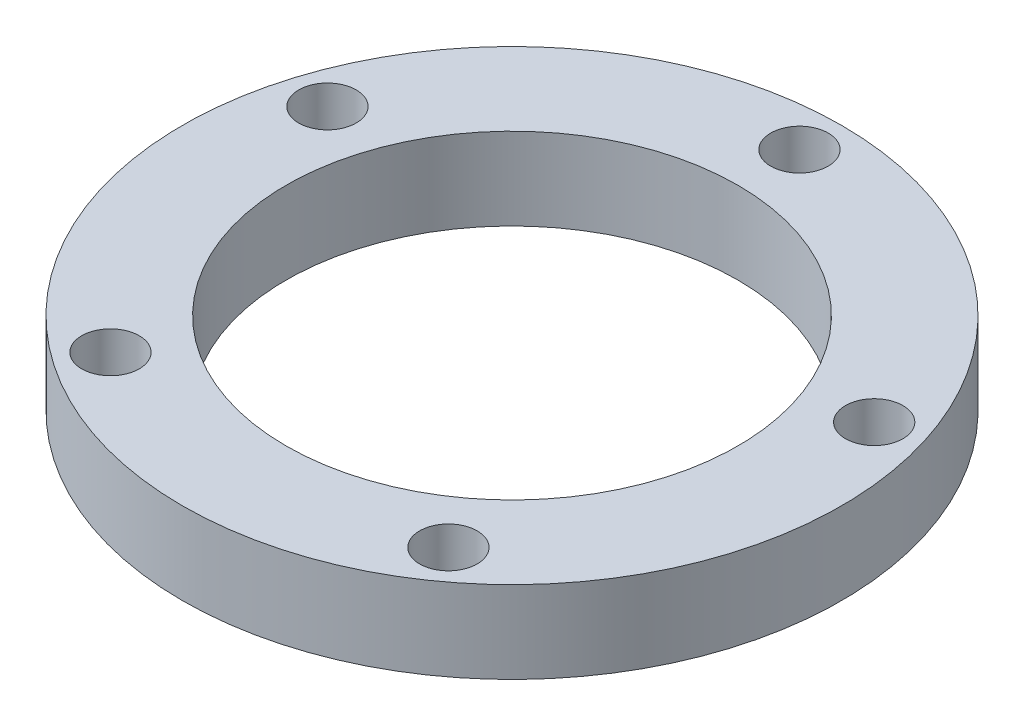
ISO-10303-21;
HEADER;
FILE_DESCRIPTION(('STEP AP214'),'2;1');
FILE_NAME('part.step','',(''),(''),'','','');
FILE_SCHEMA(('AUTOMOTIVE_DESIGN { 1 0 10303 214 1 1 1 1 }'));
ENDSEC;
DATA;
#1=APPLICATION_CONTEXT('core data for automotive mechanical design processes');
#2=APPLICATION_PROTOCOL_DEFINITION('international standard','automotive_design',2000,#1);
#3=PRODUCT_CONTEXT('',#1,'mechanical');
#4=PRODUCT('Part','Part','',(#3));
#5=PRODUCT_RELATED_PRODUCT_CATEGORY('part','',(#4));
#6=PRODUCT_DEFINITION_FORMATION('','',#4);
#7=PRODUCT_DEFINITION_CONTEXT('part definition',#1,'design');
#8=PRODUCT_DEFINITION('design','',#6,#7);
#9=PRODUCT_DEFINITION_SHAPE('','',#8);
#10=(LENGTH_UNIT() NAMED_UNIT(*) SI_UNIT(.MILLI.,.METRE.));
#11=(NAMED_UNIT(*) PLANE_ANGLE_UNIT() SI_UNIT($,.RADIAN.));
#12=(NAMED_UNIT(*) SI_UNIT($,.STERADIAN.) SOLID_ANGLE_UNIT());
#13=UNCERTAINTY_MEASURE_WITH_UNIT(LENGTH_MEASURE(1.E-05),#10,'distance_accuracy_value','');
#14=(GEOMETRIC_REPRESENTATION_CONTEXT(3) GLOBAL_UNCERTAINTY_ASSIGNED_CONTEXT((#13)) GLOBAL_UNIT_ASSIGNED_CONTEXT((#10,
#11,#12)) REPRESENTATION_CONTEXT('',''));
#15=CARTESIAN_POINT('',(0.,0.,0.));
#16=DIRECTION('',(0.,0.,1.));
#17=DIRECTION('',(1.,0.,0.));
#18=AXIS2_PLACEMENT_3D('',#15,#16,#17);
#19=CARTESIAN_POINT('',(0.,10.,0.));
#20=DIRECTION('',(0.,-1.,0.));
#21=DIRECTION('',(0.,0.,-1.));
#22=AXIS2_PLACEMENT_3D('',#19,#20,#21);
#23=CYLINDRICAL_SURFACE('',#22,40.125);
#24=CARTESIAN_POINT('',(0.,10.,0.));
#25=DIRECTION('',(0.,1.,0.));
#26=DIRECTION('',(0.,0.,1.));
#27=AXIS2_PLACEMENT_3D('',#24,#25,#26);
#28=CIRCLE('',#27,40.125);
#29=CARTESIAN_POINT('',(0.,10.,40.125));
#30=VERTEX_POINT('',#29);
#31=EDGE_CURVE('E10',#30,#30,#28,.T.);
#32=ORIENTED_EDGE('',*,*,#31,.F.);
#33=EDGE_LOOP('',(#32));
#34=FACE_BOUND('',#33,.T.);
#35=CARTESIAN_POINT('',(0.,0.,0.));
#36=DIRECTION('',(0.,1.,0.));
#37=DIRECTION('',(0.,0.,1.));
#38=AXIS2_PLACEMENT_3D('',#35,#36,#37);
#39=CIRCLE('',#38,40.125);
#40=CARTESIAN_POINT('',(0.,0.,40.125));
#41=VERTEX_POINT('',#40);
#42=EDGE_CURVE('E34',#41,#41,#39,.T.);
#43=ORIENTED_EDGE('',*,*,#42,.T.);
#44=EDGE_LOOP('',(#43));
#45=FACE_BOUND('',#44,.T.);
#46=ADVANCED_FACE('F31',(#34,#45),#23,.T.);
#47=CARTESIAN_POINT('',(0.,10.,0.));
#48=DIRECTION('',(0.,1.,0.));
#49=DIRECTION('',(0.,0.,1.));
#50=AXIS2_PLACEMENT_3D('',#47,#48,#49);
#51=PLANE('',#50);
#52=CARTESIAN_POINT('',(0.,10.,-35.));
#53=DIRECTION('',(0.,1.,0.));
#54=DIRECTION('',(0.,0.,1.));
#55=AXIS2_PLACEMENT_3D('',#52,#53,#54);
#56=CIRCLE('',#55,3.5);
#57=CARTESIAN_POINT('',(0.,10.,-31.5));
#58=VERTEX_POINT('',#57);
#59=EDGE_CURVE('E73',#58,#58,#56,.T.);
#60=ORIENTED_EDGE('',*,*,#59,.F.);
#61=EDGE_LOOP('',(#60));
#62=FACE_BOUND('',#61,.T.);
#63=CARTESIAN_POINT('',(33.2869780703304,10.,-10.8155948031232));
#64=DIRECTION('',(0.,1.,0.));
#65=DIRECTION('',(0.,0.,1.));
#66=AXIS2_PLACEMENT_3D('',#63,#64,#65);
#67=CIRCLE('',#66,3.5);
#68=CARTESIAN_POINT('',(33.2869780703304,10.,-7.31559480312317));
#69=VERTEX_POINT('',#68);
#70=EDGE_CURVE('E67',#69,#69,#67,.T.);
#71=ORIENTED_EDGE('',*,*,#70,.F.);
#72=EDGE_LOOP('',(#71));
#73=FACE_BOUND('',#72,.T.);
#74=CARTESIAN_POINT('',(20.5724838302366,10.,28.3155948031232));
#75=DIRECTION('',(0.,1.,0.));
#76=DIRECTION('',(0.,0.,1.));
#77=AXIS2_PLACEMENT_3D('',#74,#75,#76);
#78=CIRCLE('',#77,3.5);
#79=CARTESIAN_POINT('',(20.5724838302366,10.,31.8155948031232));
#80=VERTEX_POINT('',#79);
#81=EDGE_CURVE('E61',#80,#80,#78,.T.);
#82=ORIENTED_EDGE('',*,*,#81,.F.);
#83=EDGE_LOOP('',(#82));
#84=FACE_BOUND('',#83,.T.);
#85=CARTESIAN_POINT('',(-20.5724838302366,10.,28.3155948031232));
#86=DIRECTION('',(0.,1.,0.));
#87=DIRECTION('',(0.,0.,1.));
#88=AXIS2_PLACEMENT_3D('',#85,#86,#87);
#89=CIRCLE('',#88,3.5);
#90=CARTESIAN_POINT('',(-20.5724838302366,10.,31.8155948031232));
#91=VERTEX_POINT('',#90);
#92=EDGE_CURVE('E55',#91,#91,#89,.T.);
#93=ORIENTED_EDGE('',*,*,#92,.F.);
#94=EDGE_LOOP('',(#93));
#95=FACE_BOUND('',#94,.T.);
#96=CARTESIAN_POINT('',(-33.2869780703304,10.,-10.8155948031232));
#97=DIRECTION('',(0.,1.,0.));
#98=DIRECTION('',(0.,0.,1.));
#99=AXIS2_PLACEMENT_3D('',#96,#97,#98);
#100=CIRCLE('',#99,3.5);
#101=CARTESIAN_POINT('',(-33.2869780703304,10.,-7.31559480312315));
#102=VERTEX_POINT('',#101);
#103=EDGE_CURVE('E49',#102,#102,#100,.T.);
#104=ORIENTED_EDGE('',*,*,#103,.F.);
#105=EDGE_LOOP('',(#104));
#106=FACE_BOUND('',#105,.T.);
#107=CARTESIAN_POINT('',(0.,10.,0.));
#108=DIRECTION('',(0.,1.,0.));
#109=DIRECTION('',(0.,0.,1.));
#110=AXIS2_PLACEMENT_3D('',#107,#108,#109);
#111=CIRCLE('',#110,27.5);
#112=CARTESIAN_POINT('',(0.,10.,27.5));
#113=VERTEX_POINT('',#112);
#114=EDGE_CURVE('E43',#113,#113,#111,.T.);
#115=ORIENTED_EDGE('',*,*,#114,.F.);
#116=EDGE_LOOP('',(#115));
#117=FACE_BOUND('',#116,.T.);
#118=ORIENTED_EDGE('',*,*,#31,.T.);
#119=EDGE_LOOP('',(#118));
#120=FACE_BOUND('',#119,.T.);
#121=ADVANCED_FACE('F89',(#62,#73,#84,#95,#106,#117,#120),#51,.T.);
#122=CARTESIAN_POINT('',(0.,0.,0.));
#123=DIRECTION('',(0.,1.,0.));
#124=DIRECTION('',(0.,0.,1.));
#125=AXIS2_PLACEMENT_3D('',#122,#123,#124);
#126=PLANE('',#125);
#127=CARTESIAN_POINT('',(0.,0.,-35.));
#128=DIRECTION('',(0.,1.,0.));
#129=DIRECTION('',(0.,0.,1.));
#130=AXIS2_PLACEMENT_3D('',#127,#128,#129);
#131=CIRCLE('',#130,3.5);
#132=CARTESIAN_POINT('',(0.,0.,-31.5));
#133=VERTEX_POINT('',#132);
#134=EDGE_CURVE('E46',#133,#133,#131,.T.);
#135=ORIENTED_EDGE('',*,*,#134,.T.);
#136=EDGE_LOOP('',(#135));
#137=FACE_BOUND('',#136,.T.);
#138=CARTESIAN_POINT('',(33.2869780703304,0.,-10.8155948031232));
#139=DIRECTION('',(0.,1.,0.));
#140=DIRECTION('',(0.,0.,1.));
#141=AXIS2_PLACEMENT_3D('',#138,#139,#140);
#142=CIRCLE('',#141,3.5);
#143=CARTESIAN_POINT('',(33.2869780703304,0.,-7.31559480312317));
#144=VERTEX_POINT('',#143);
#145=EDGE_CURVE('E70',#144,#144,#142,.T.);
#146=ORIENTED_EDGE('',*,*,#145,.T.);
#147=EDGE_LOOP('',(#146));
#148=FACE_BOUND('',#147,.T.);
#149=CARTESIAN_POINT('',(20.5724838302366,0.,28.3155948031232));
#150=DIRECTION('',(0.,1.,0.));
#151=DIRECTION('',(0.,0.,1.));
#152=AXIS2_PLACEMENT_3D('',#149,#150,#151);
#153=CIRCLE('',#152,3.5);
#154=CARTESIAN_POINT('',(20.5724838302366,0.,31.8155948031232));
#155=VERTEX_POINT('',#154);
#156=EDGE_CURVE('E64',#155,#155,#153,.T.);
#157=ORIENTED_EDGE('',*,*,#156,.T.);
#158=EDGE_LOOP('',(#157));
#159=FACE_BOUND('',#158,.T.);
#160=CARTESIAN_POINT('',(-20.5724838302366,0.,28.3155948031232));
#161=DIRECTION('',(0.,1.,0.));
#162=DIRECTION('',(0.,0.,1.));
#163=AXIS2_PLACEMENT_3D('',#160,#161,#162);
#164=CIRCLE('',#163,3.5);
#165=CARTESIAN_POINT('',(-20.5724838302366,0.,31.8155948031232));
#166=VERTEX_POINT('',#165);
#167=EDGE_CURVE('E58',#166,#166,#164,.T.);
#168=ORIENTED_EDGE('',*,*,#167,.T.);
#169=EDGE_LOOP('',(#168));
#170=FACE_BOUND('',#169,.T.);
#171=CARTESIAN_POINT('',(-33.2869780703304,0.,-10.8155948031232));
#172=DIRECTION('',(0.,1.,0.));
#173=DIRECTION('',(0.,0.,1.));
#174=AXIS2_PLACEMENT_3D('',#171,#172,#173);
#175=CIRCLE('',#174,3.5);
#176=CARTESIAN_POINT('',(-33.2869780703304,0.,-7.31559480312315));
#177=VERTEX_POINT('',#176);
#178=EDGE_CURVE('E52',#177,#177,#175,.T.);
#179=ORIENTED_EDGE('',*,*,#178,.T.);
#180=EDGE_LOOP('',(#179));
#181=FACE_BOUND('',#180,.T.);
#182=CARTESIAN_POINT('',(0.,0.,0.));
#183=DIRECTION('',(0.,1.,0.));
#184=DIRECTION('',(0.,0.,1.));
#185=AXIS2_PLACEMENT_3D('',#182,#183,#184);
#186=CIRCLE('',#185,27.5);
#187=CARTESIAN_POINT('',(0.,0.,27.5));
#188=VERTEX_POINT('',#187);
#189=EDGE_CURVE('E41',#188,#188,#186,.T.);
#190=ORIENTED_EDGE('',*,*,#189,.T.);
#191=EDGE_LOOP('',(#190));
#192=FACE_BOUND('',#191,.T.);
#193=ORIENTED_EDGE('',*,*,#42,.F.);
#194=EDGE_LOOP('',(#193));
#195=FACE_BOUND('',#194,.T.);
#196=ADVANCED_FACE('F79',(#137,#148,#159,#170,#181,#192,#195),#126,.F.);
#197=CARTESIAN_POINT('',(0.,0.,0.));
#198=DIRECTION('',(0.,1.,0.));
#199=DIRECTION('',(0.,0.,1.));
#200=AXIS2_PLACEMENT_3D('',#197,#198,#199);
#201=CYLINDRICAL_SURFACE('',#200,27.5);
#202=ORIENTED_EDGE('',*,*,#189,.F.);
#203=EDGE_LOOP('',(#202));
#204=FACE_BOUND('',#203,.T.);
#205=ORIENTED_EDGE('',*,*,#114,.T.);
#206=EDGE_LOOP('',(#205));
#207=FACE_BOUND('',#206,.T.);
#208=ADVANCED_FACE('F103',(#204,#207),#201,.F.);
#209=CARTESIAN_POINT('',(-33.2869780703304,0.,-10.8155948031232));
#210=DIRECTION('',(0.,1.,0.));
#211=DIRECTION('',(0.,0.,1.));
#212=AXIS2_PLACEMENT_3D('',#209,#210,#211);
#213=CYLINDRICAL_SURFACE('',#212,3.5);
#214=ORIENTED_EDGE('',*,*,#178,.F.);
#215=EDGE_LOOP('',(#214));
#216=FACE_BOUND('',#215,.T.);
#217=ORIENTED_EDGE('',*,*,#103,.T.);
#218=EDGE_LOOP('',(#217));
#219=FACE_BOUND('',#218,.T.);
#220=ADVANCED_FACE('F105',(#216,#219),#213,.F.);
#221=CARTESIAN_POINT('',(-20.5724838302366,0.,28.3155948031232));
#222=DIRECTION('',(0.,1.,0.));
#223=DIRECTION('',(0.,0.,1.));
#224=AXIS2_PLACEMENT_3D('',#221,#222,#223);
#225=CYLINDRICAL_SURFACE('',#224,3.5);
#226=ORIENTED_EDGE('',*,*,#167,.F.);
#227=EDGE_LOOP('',(#226));
#228=FACE_BOUND('',#227,.T.);
#229=ORIENTED_EDGE('',*,*,#92,.T.);
#230=EDGE_LOOP('',(#229));
#231=FACE_BOUND('',#230,.T.);
#232=ADVANCED_FACE('F112',(#228,#231),#225,.F.);
#233=CARTESIAN_POINT('',(20.5724838302366,0.,28.3155948031232));
#234=DIRECTION('',(0.,1.,0.));
#235=DIRECTION('',(0.,0.,1.));
#236=AXIS2_PLACEMENT_3D('',#233,#234,#235);
#237=CYLINDRICAL_SURFACE('',#236,3.5);
#238=ORIENTED_EDGE('',*,*,#156,.F.);
#239=EDGE_LOOP('',(#238));
#240=FACE_BOUND('',#239,.T.);
#241=ORIENTED_EDGE('',*,*,#81,.T.);
#242=EDGE_LOOP('',(#241));
#243=FACE_BOUND('',#242,.T.);
#244=ADVANCED_FACE('F147',(#240,#243),#237,.F.);
#245=CARTESIAN_POINT('',(33.2869780703304,0.,-10.8155948031232));
#246=DIRECTION('',(0.,1.,0.));
#247=DIRECTION('',(0.,0.,1.));
#248=AXIS2_PLACEMENT_3D('',#245,#246,#247);
#249=CYLINDRICAL_SURFACE('',#248,3.5);
#250=ORIENTED_EDGE('',*,*,#145,.F.);
#251=EDGE_LOOP('',(#250));
#252=FACE_BOUND('',#251,.T.);
#253=ORIENTED_EDGE('',*,*,#70,.T.);
#254=EDGE_LOOP('',(#253));
#255=FACE_BOUND('',#254,.T.);
#256=ADVANCED_FACE('F85',(#252,#255),#249,.F.);
#257=CARTESIAN_POINT('',(0.,0.,-35.));
#258=DIRECTION('',(0.,1.,0.));
#259=DIRECTION('',(0.,0.,1.));
#260=AXIS2_PLACEMENT_3D('',#257,#258,#259);
#261=CYLINDRICAL_SURFACE('',#260,3.5);
#262=ORIENTED_EDGE('',*,*,#134,.F.);
#263=EDGE_LOOP('',(#262));
#264=FACE_BOUND('',#263,.T.);
#265=ORIENTED_EDGE('',*,*,#59,.T.);
#266=EDGE_LOOP('',(#265));
#267=FACE_BOUND('',#266,.T.);
#268=ADVANCED_FACE('F82',(#264,#267),#261,.F.);
#269=CLOSED_SHELL('',(#46,#121,#196,#208,#220,#232,#244,#256,#268));
#270=MANIFOLD_SOLID_BREP('B2',#269);
#271=ADVANCED_BREP_SHAPE_REPRESENTATION('',(#18,#270),#14);
#272=SHAPE_DEFINITION_REPRESENTATION(#9,#271);
ENDSEC;
END-ISO-10303-21;
